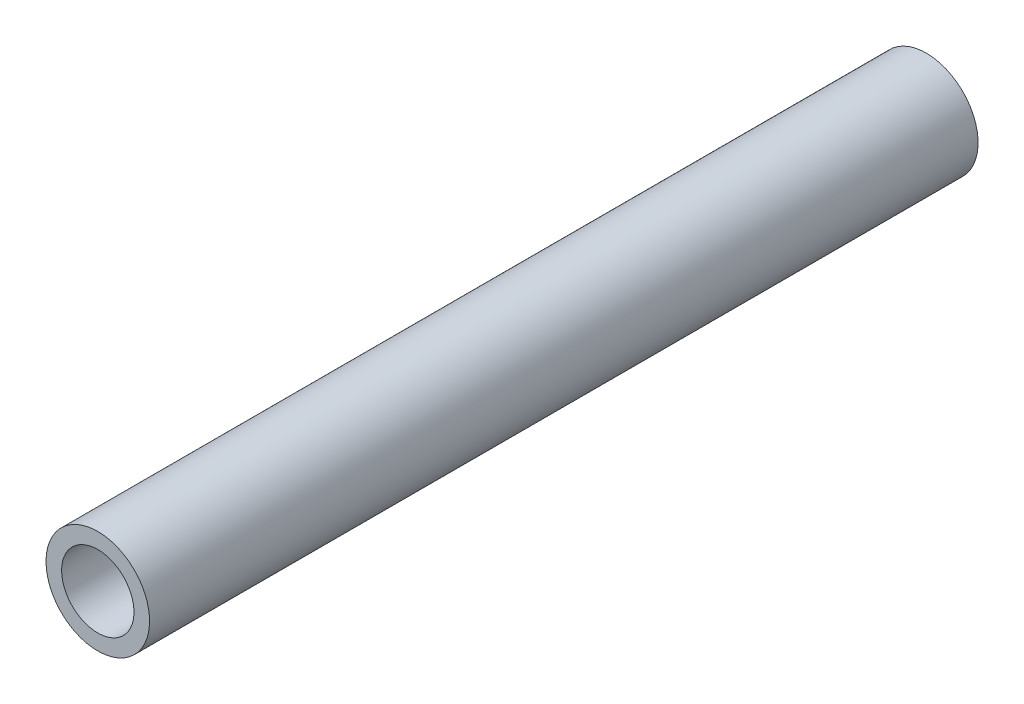
ISO-10303-21;
HEADER;
FILE_DESCRIPTION(('STEP AP214'),'2;1');
FILE_NAME('part.step','',(''),(''),'','','');
FILE_SCHEMA(('AUTOMOTIVE_DESIGN { 1 0 10303 214 1 1 1 1 }'));
ENDSEC;
DATA;
#1=APPLICATION_CONTEXT('core data for automotive mechanical design processes');
#2=APPLICATION_PROTOCOL_DEFINITION('international standard','automotive_design',2000,#1);
#3=PRODUCT_CONTEXT('',#1,'mechanical');
#4=PRODUCT('Part','Part','',(#3));
#5=PRODUCT_RELATED_PRODUCT_CATEGORY('part','',(#4));
#6=PRODUCT_DEFINITION_FORMATION('','',#4);
#7=PRODUCT_DEFINITION_CONTEXT('part definition',#1,'design');
#8=PRODUCT_DEFINITION('design','',#6,#7);
#9=PRODUCT_DEFINITION_SHAPE('','',#8);
#10=(LENGTH_UNIT() NAMED_UNIT(*) SI_UNIT(.MILLI.,.METRE.));
#11=(NAMED_UNIT(*) PLANE_ANGLE_UNIT() SI_UNIT($,.RADIAN.));
#12=(NAMED_UNIT(*) SI_UNIT($,.STERADIAN.) SOLID_ANGLE_UNIT());
#13=UNCERTAINTY_MEASURE_WITH_UNIT(LENGTH_MEASURE(1.E-05),#10,'distance_accuracy_value','');
#14=(GEOMETRIC_REPRESENTATION_CONTEXT(3) GLOBAL_UNCERTAINTY_ASSIGNED_CONTEXT((#13)) GLOBAL_UNIT_ASSIGNED_CONTEXT((#10,
#11,#12)) REPRESENTATION_CONTEXT('',''));
#15=CARTESIAN_POINT('',(0.,0.,0.));
#16=DIRECTION('',(0.,0.,1.));
#17=DIRECTION('',(1.,0.,0.));
#18=AXIS2_PLACEMENT_3D('',#15,#16,#17);
#19=CARTESIAN_POINT('',(0.,0.,152.4));
#20=DIRECTION('',(0.,0.,1.));
#21=DIRECTION('',(1.,0.,0.));
#22=AXIS2_PLACEMENT_3D('',#19,#20,#21);
#23=PLANE('',#22);
#24=CARTESIAN_POINT('',(0.,0.,152.4));
#25=DIRECTION('',(0.,0.,1.));
#26=DIRECTION('',(1.,0.,0.));
#27=AXIS2_PLACEMENT_3D('',#24,#25,#26);
#28=CIRCLE('',#27,9.525);
#29=CARTESIAN_POINT('',(-9.525,0.,152.4));
#30=VERTEX_POINT('',#29);
#31=EDGE_CURVE('E11',#30,#30,#28,.T.);
#32=ORIENTED_EDGE('',*,*,#31,.T.);
#33=EDGE_LOOP('',(#32));
#34=FACE_BOUND('',#33,.T.);
#35=CARTESIAN_POINT('',(0.,0.,152.4));
#36=DIRECTION('',(0.,0.,1.));
#37=DIRECTION('',(1.,0.,0.));
#38=AXIS2_PLACEMENT_3D('',#35,#36,#37);
#39=CIRCLE('',#38,6.6548);
#40=CARTESIAN_POINT('',(-6.6548,0.,152.4));
#41=VERTEX_POINT('',#40);
#42=EDGE_CURVE('E48',#41,#41,#39,.T.);
#43=ORIENTED_EDGE('',*,*,#42,.F.);
#44=EDGE_LOOP('',(#43));
#45=FACE_BOUND('',#44,.T.);
#46=ADVANCED_FACE('F37',(#34,#45),#23,.T.);
#47=CARTESIAN_POINT('',(0.,0.,0.));
#48=DIRECTION('',(0.,0.,1.));
#49=DIRECTION('',(1.,0.,0.));
#50=AXIS2_PLACEMENT_3D('',#47,#48,#49);
#51=PLANE('',#50);
#52=CARTESIAN_POINT('',(0.,0.,0.));
#53=DIRECTION('',(0.,0.,1.));
#54=DIRECTION('',(1.,0.,0.));
#55=AXIS2_PLACEMENT_3D('',#52,#53,#54);
#56=CIRCLE('',#55,9.525);
#57=CARTESIAN_POINT('',(-9.525,0.,0.));
#58=VERTEX_POINT('',#57);
#59=EDGE_CURVE('E41',#58,#58,#56,.T.);
#60=ORIENTED_EDGE('',*,*,#59,.F.);
#61=EDGE_LOOP('',(#60));
#62=FACE_BOUND('',#61,.T.);
#63=CARTESIAN_POINT('',(0.,0.,0.));
#64=DIRECTION('',(0.,0.,1.));
#65=DIRECTION('',(1.,0.,0.));
#66=AXIS2_PLACEMENT_3D('',#63,#64,#65);
#67=CIRCLE('',#66,6.6548);
#68=CARTESIAN_POINT('',(-6.6548,0.,0.));
#69=VERTEX_POINT('',#68);
#70=EDGE_CURVE('E50',#69,#69,#67,.T.);
#71=ORIENTED_EDGE('',*,*,#70,.T.);
#72=EDGE_LOOP('',(#71));
#73=FACE_BOUND('',#72,.T.);
#74=ADVANCED_FACE('F60',(#62,#73),#51,.F.);
#75=CARTESIAN_POINT('',(0.,0.,152.4));
#76=DIRECTION('',(0.,0.,-1.));
#77=DIRECTION('',(-1.,0.,0.));
#78=AXIS2_PLACEMENT_3D('',#75,#76,#77);
#79=CYLINDRICAL_SURFACE('',#78,9.525);
#80=CARTESIAN_POINT('',(-9.525,0.,152.4));
#81=CARTESIAN_POINT('',(-9.525,0.,150.8125));
#82=CARTESIAN_POINT('',(-9.525,0.,149.225));
#83=CARTESIAN_POINT('',(-9.525,0.,146.05));
#84=CARTESIAN_POINT('',(-9.525,0.,144.4625));
#85=CARTESIAN_POINT('',(-9.525,0.,141.2875));
#86=CARTESIAN_POINT('',(-9.525,0.,139.7));
#87=CARTESIAN_POINT('',(-9.525,0.,136.525));
#88=CARTESIAN_POINT('',(-9.525,0.,134.9375));
#89=CARTESIAN_POINT('',(-9.525,0.,131.7625));
#90=CARTESIAN_POINT('',(-9.525,0.,130.175));
#91=CARTESIAN_POINT('',(-9.525,0.,127.));
#92=CARTESIAN_POINT('',(-9.525,0.,125.4125));
#93=CARTESIAN_POINT('',(-9.525,0.,122.2375));
#94=CARTESIAN_POINT('',(-9.525,0.,120.65));
#95=CARTESIAN_POINT('',(-9.525,0.,117.475));
#96=CARTESIAN_POINT('',(-9.525,0.,115.8875));
#97=CARTESIAN_POINT('',(-9.525,0.,112.7125));
#98=CARTESIAN_POINT('',(-9.525,0.,111.125));
#99=CARTESIAN_POINT('',(-9.525,0.,107.95));
#100=CARTESIAN_POINT('',(-9.525,0.,106.3625));
#101=CARTESIAN_POINT('',(-9.525,0.,103.1875));
#102=CARTESIAN_POINT('',(-9.525,0.,101.6));
#103=CARTESIAN_POINT('',(-9.525,0.,98.425));
#104=CARTESIAN_POINT('',(-9.525,0.,96.8375));
#105=CARTESIAN_POINT('',(-9.525,0.,93.6625));
#106=CARTESIAN_POINT('',(-9.525,0.,92.075));
#107=CARTESIAN_POINT('',(-9.525,0.,88.9));
#108=CARTESIAN_POINT('',(-9.525,0.,87.3125));
#109=CARTESIAN_POINT('',(-9.525,0.,84.1375));
#110=CARTESIAN_POINT('',(-9.525,0.,82.55));
#111=CARTESIAN_POINT('',(-9.525,0.,79.375));
#112=CARTESIAN_POINT('',(-9.525,0.,77.7875));
#113=CARTESIAN_POINT('',(-9.525,0.,74.6125));
#114=CARTESIAN_POINT('',(-9.525,0.,73.025));
#115=CARTESIAN_POINT('',(-9.525,0.,69.85));
#116=CARTESIAN_POINT('',(-9.525,0.,68.2625));
#117=CARTESIAN_POINT('',(-9.525,0.,65.0875));
#118=CARTESIAN_POINT('',(-9.525,0.,63.5));
#119=CARTESIAN_POINT('',(-9.525,0.,60.325));
#120=CARTESIAN_POINT('',(-9.525,0.,58.7375));
#121=CARTESIAN_POINT('',(-9.525,0.,55.5625));
#122=CARTESIAN_POINT('',(-9.525,0.,53.975));
#123=CARTESIAN_POINT('',(-9.525,0.,50.8));
#124=CARTESIAN_POINT('',(-9.525,0.,49.2125));
#125=CARTESIAN_POINT('',(-9.525,0.,46.0375));
#126=CARTESIAN_POINT('',(-9.525,0.,44.45));
#127=CARTESIAN_POINT('',(-9.525,0.,41.275));
#128=CARTESIAN_POINT('',(-9.525,0.,39.6875));
#129=CARTESIAN_POINT('',(-9.525,0.,36.5125));
#130=CARTESIAN_POINT('',(-9.525,0.,34.925));
#131=CARTESIAN_POINT('',(-9.525,0.,31.75));
#132=CARTESIAN_POINT('',(-9.525,0.,30.1625));
#133=CARTESIAN_POINT('',(-9.525,0.,26.9875));
#134=CARTESIAN_POINT('',(-9.525,0.,25.4));
#135=CARTESIAN_POINT('',(-9.525,0.,22.225));
#136=CARTESIAN_POINT('',(-9.525,0.,20.6375));
#137=CARTESIAN_POINT('',(-9.525,0.,17.4625));
#138=CARTESIAN_POINT('',(-9.525,0.,15.875));
#139=CARTESIAN_POINT('',(-9.525,0.,12.7));
#140=CARTESIAN_POINT('',(-9.525,0.,11.1125));
#141=CARTESIAN_POINT('',(-9.525,0.,7.93750000000001));
#142=CARTESIAN_POINT('',(-9.525,0.,6.35));
#143=CARTESIAN_POINT('',(-9.525,0.,3.175));
#144=CARTESIAN_POINT('',(-9.525,0.,1.5875));
#145=CARTESIAN_POINT('',(-9.525,0.,0.));
#146=B_SPLINE_CURVE_WITH_KNOTS('',3,(#80,#81,#82,#83,#84,#85,#86,#87,#88,#89,#90,#91,#92,#93,
#94,#95,#96,#97,#98,#99,#100,#101,#102,#103,#104,#105,#106,#107,#108,#109,#110,#111,#112,#113,
#114,#115,#116,#117,#118,#119,#120,#121,#122,#123,#124,#125,#126,#127,#128,#129,#130,#131,#132,
#133,#134,#135,#136,#137,#138,#139,#140,#141,#142,#143,#144,#145),.UNSPECIFIED.,.F.,.F.,(4,2,2,
2,2,2,2,2,2,2,2,2,2,2,2,2,2,2,2,2,2,2,2,2,2,2,2,2,2,2,2,2,4),(0.,4.7625,9.52500000000001,
14.2875,19.05,23.8125,28.575,33.3375,38.1,42.8625,47.625,52.3875,57.15,61.9125,66.675,71.4375,
76.2,80.9625,85.725,90.4875,95.25,100.0125,104.775,109.5375,114.3,119.0625,123.825,128.5875,
133.35,138.1125,142.875,147.6375,152.4),.UNSPECIFIED.);
#147=EDGE_CURVE('BSEAM39',#30,#58,#146,.T.);
#148=ORIENTED_EDGE('',*,*,#31,.F.);
#149=ORIENTED_EDGE('',*,*,#59,.T.);
#150=ORIENTED_EDGE('',*,*,#147,.T.);
#151=ORIENTED_EDGE('',*,*,#147,.F.);
#152=EDGE_LOOP('',(#148,#150,#149,#151));
#153=FACE_BOUND('',#152,.T.);
#154=ADVANCED_FACE('F39',(#153),#79,.T.);
#155=CARTESIAN_POINT('',(0.,0.,152.4));
#156=DIRECTION('',(0.,0.,-1.));
#157=DIRECTION('',(-1.,0.,0.));
#158=AXIS2_PLACEMENT_3D('',#155,#156,#157);
#159=CYLINDRICAL_SURFACE('',#158,6.6548);
#160=CARTESIAN_POINT('',(-6.6548,0.,152.4));
#161=CARTESIAN_POINT('',(-6.6548,0.,150.8125));
#162=CARTESIAN_POINT('',(-6.6548,0.,149.225));
#163=CARTESIAN_POINT('',(-6.6548,0.,146.05));
#164=CARTESIAN_POINT('',(-6.6548,0.,144.4625));
#165=CARTESIAN_POINT('',(-6.6548,0.,141.2875));
#166=CARTESIAN_POINT('',(-6.6548,0.,139.7));
#167=CARTESIAN_POINT('',(-6.6548,0.,136.525));
#168=CARTESIAN_POINT('',(-6.6548,0.,134.9375));
#169=CARTESIAN_POINT('',(-6.6548,0.,131.7625));
#170=CARTESIAN_POINT('',(-6.6548,0.,130.175));
#171=CARTESIAN_POINT('',(-6.6548,0.,127.));
#172=CARTESIAN_POINT('',(-6.6548,0.,125.4125));
#173=CARTESIAN_POINT('',(-6.6548,0.,122.2375));
#174=CARTESIAN_POINT('',(-6.6548,0.,120.65));
#175=CARTESIAN_POINT('',(-6.6548,0.,117.475));
#176=CARTESIAN_POINT('',(-6.6548,0.,115.8875));
#177=CARTESIAN_POINT('',(-6.6548,0.,112.7125));
#178=CARTESIAN_POINT('',(-6.6548,0.,111.125));
#179=CARTESIAN_POINT('',(-6.6548,0.,107.95));
#180=CARTESIAN_POINT('',(-6.6548,0.,106.3625));
#181=CARTESIAN_POINT('',(-6.6548,0.,103.1875));
#182=CARTESIAN_POINT('',(-6.6548,0.,101.6));
#183=CARTESIAN_POINT('',(-6.6548,0.,98.425));
#184=CARTESIAN_POINT('',(-6.6548,0.,96.8375));
#185=CARTESIAN_POINT('',(-6.6548,0.,93.6625));
#186=CARTESIAN_POINT('',(-6.6548,0.,92.075));
#187=CARTESIAN_POINT('',(-6.6548,0.,88.9));
#188=CARTESIAN_POINT('',(-6.6548,0.,87.3125));
#189=CARTESIAN_POINT('',(-6.6548,0.,84.1375));
#190=CARTESIAN_POINT('',(-6.6548,0.,82.55));
#191=CARTESIAN_POINT('',(-6.6548,0.,79.375));
#192=CARTESIAN_POINT('',(-6.6548,0.,77.7875));
#193=CARTESIAN_POINT('',(-6.6548,0.,74.6125));
#194=CARTESIAN_POINT('',(-6.6548,0.,73.025));
#195=CARTESIAN_POINT('',(-6.6548,0.,69.85));
#196=CARTESIAN_POINT('',(-6.6548,0.,68.2625));
#197=CARTESIAN_POINT('',(-6.6548,0.,65.0875));
#198=CARTESIAN_POINT('',(-6.6548,0.,63.5));
#199=CARTESIAN_POINT('',(-6.6548,0.,60.325));
#200=CARTESIAN_POINT('',(-6.6548,0.,58.7375));
#201=CARTESIAN_POINT('',(-6.6548,0.,55.5625));
#202=CARTESIAN_POINT('',(-6.6548,0.,53.975));
#203=CARTESIAN_POINT('',(-6.6548,0.,50.8));
#204=CARTESIAN_POINT('',(-6.6548,0.,49.2125));
#205=CARTESIAN_POINT('',(-6.6548,0.,46.0375));
#206=CARTESIAN_POINT('',(-6.6548,0.,44.45));
#207=CARTESIAN_POINT('',(-6.6548,0.,41.275));
#208=CARTESIAN_POINT('',(-6.6548,0.,39.6875));
#209=CARTESIAN_POINT('',(-6.6548,0.,36.5125));
#210=CARTESIAN_POINT('',(-6.6548,0.,34.925));
#211=CARTESIAN_POINT('',(-6.6548,0.,31.75));
#212=CARTESIAN_POINT('',(-6.6548,0.,30.1625));
#213=CARTESIAN_POINT('',(-6.6548,0.,26.9875));
#214=CARTESIAN_POINT('',(-6.6548,0.,25.4));
#215=CARTESIAN_POINT('',(-6.6548,0.,22.225));
#216=CARTESIAN_POINT('',(-6.6548,0.,20.6375));
#217=CARTESIAN_POINT('',(-6.6548,0.,17.4625));
#218=CARTESIAN_POINT('',(-6.6548,0.,15.875));
#219=CARTESIAN_POINT('',(-6.6548,0.,12.7));
#220=CARTESIAN_POINT('',(-6.6548,0.,11.1125));
#221=CARTESIAN_POINT('',(-6.6548,0.,7.93750000000001));
#222=CARTESIAN_POINT('',(-6.6548,0.,6.35));
#223=CARTESIAN_POINT('',(-6.6548,0.,3.175));
#224=CARTESIAN_POINT('',(-6.6548,0.,1.5875));
#225=CARTESIAN_POINT('',(-6.6548,0.,0.));
#226=B_SPLINE_CURVE_WITH_KNOTS('',3,(#160,#161,#162,#163,#164,#165,#166,#167,#168,#169,#170,
#171,#172,#173,#174,#175,#176,#177,#178,#179,#180,#181,#182,#183,#184,#185,#186,#187,#188,#189,
#190,#191,#192,#193,#194,#195,#196,#197,#198,#199,#200,#201,#202,#203,#204,#205,#206,#207,#208,
#209,#210,#211,#212,#213,#214,#215,#216,#217,#218,#219,#220,#221,#222,#223,#224,#225),
.UNSPECIFIED.,.F.,.F.,(4,2,2,2,2,2,2,2,2,2,2,2,2,2,2,2,2,2,2,2,2,2,2,2,2,2,2,2,2,2,2,2,4),(0.,
4.7625,9.52500000000001,14.2875,19.05,23.8125,28.575,33.3375,38.1,42.8625,47.625,52.3875,57.15,
61.9125,66.675,71.4375,76.2,80.9625,85.725,90.4875,95.25,100.0125,104.775,109.5375,114.3,
119.0625,123.825,128.5875,133.35,138.1125,142.875,147.6375,152.4),.UNSPECIFIED.);
#227=EDGE_CURVE('BSEAM56',#41,#69,#226,.T.);
#228=ORIENTED_EDGE('',*,*,#42,.T.);
#229=ORIENTED_EDGE('',*,*,#70,.F.);
#230=ORIENTED_EDGE('',*,*,#227,.T.);
#231=ORIENTED_EDGE('',*,*,#227,.F.);
#232=EDGE_LOOP('',(#228,#230,#229,#231));
#233=FACE_BOUND('',#232,.T.);
#234=ADVANCED_FACE('F56',(#233),#159,.F.);
#235=CLOSED_SHELL('',(#46,#74,#154,#234));
#236=MANIFOLD_SOLID_BREP('B2',#235);
#237=ADVANCED_BREP_SHAPE_REPRESENTATION('',(#18,#236),#14);
#238=SHAPE_DEFINITION_REPRESENTATION(#9,#237);
ENDSEC;
END-ISO-10303-21;
